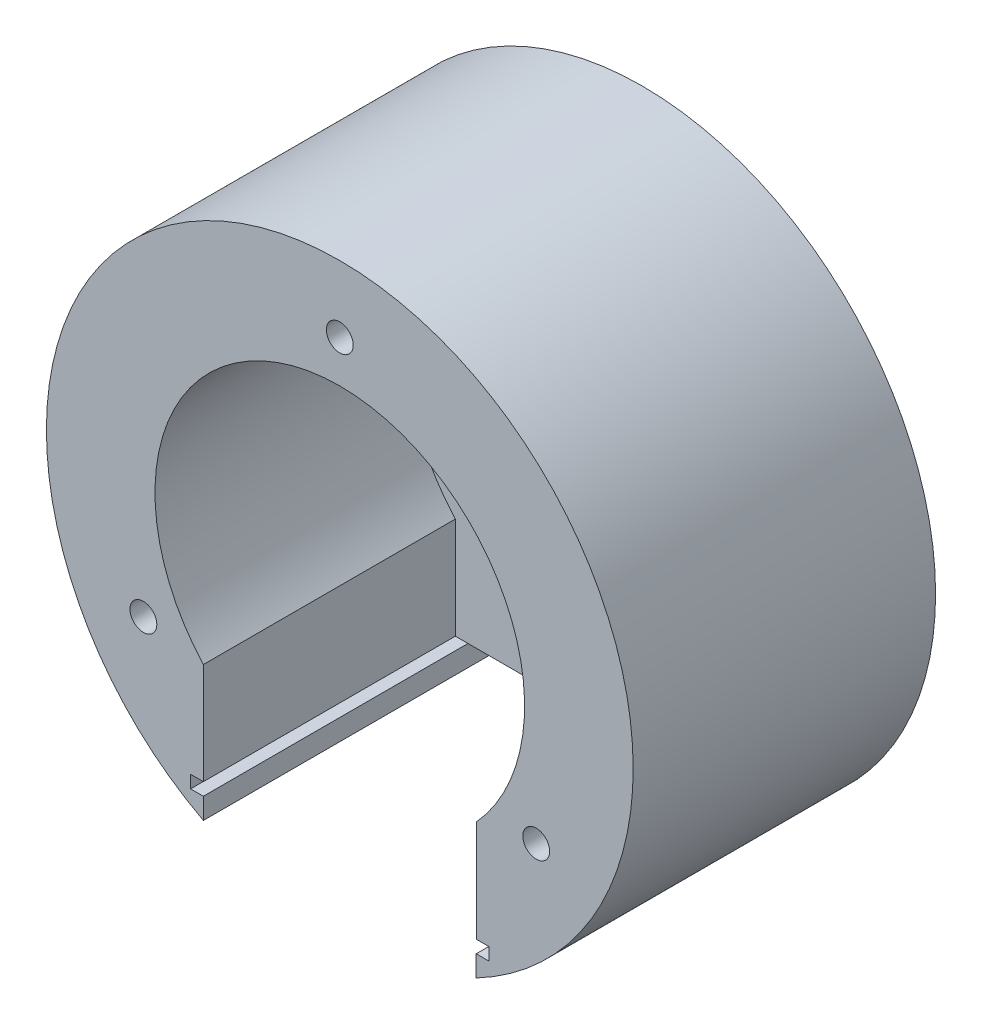
ISO-10303-21;
HEADER;
FILE_DESCRIPTION(('STEP AP214'),'2;1');
FILE_NAME('part.step','',(''),(''),'','','');
FILE_SCHEMA(('AUTOMOTIVE_DESIGN { 1 0 10303 214 1 1 1 1 }'));
ENDSEC;
DATA;
#1=APPLICATION_CONTEXT('core data for automotive mechanical design processes');
#2=APPLICATION_PROTOCOL_DEFINITION('international standard','automotive_design',2000,#1);
#3=PRODUCT_CONTEXT('',#1,'mechanical');
#4=PRODUCT('Part','Part','',(#3));
#5=PRODUCT_RELATED_PRODUCT_CATEGORY('part','',(#4));
#6=PRODUCT_DEFINITION_FORMATION('','',#4);
#7=PRODUCT_DEFINITION_CONTEXT('part definition',#1,'design');
#8=PRODUCT_DEFINITION('design','',#6,#7);
#9=PRODUCT_DEFINITION_SHAPE('','',#8);
#10=(LENGTH_UNIT() NAMED_UNIT(*) SI_UNIT(.MILLI.,.METRE.));
#11=(NAMED_UNIT(*) PLANE_ANGLE_UNIT() SI_UNIT($,.RADIAN.));
#12=(NAMED_UNIT(*) SI_UNIT($,.STERADIAN.) SOLID_ANGLE_UNIT());
#13=UNCERTAINTY_MEASURE_WITH_UNIT(LENGTH_MEASURE(1.E-05),#10,'distance_accuracy_value','');
#14=(GEOMETRIC_REPRESENTATION_CONTEXT(3) GLOBAL_UNCERTAINTY_ASSIGNED_CONTEXT((#13)) GLOBAL_UNIT_ASSIGNED_CONTEXT((#10,
#11,#12)) REPRESENTATION_CONTEXT('',''));
#15=CARTESIAN_POINT('',(0.,0.,0.));
#16=DIRECTION('',(0.,0.,1.));
#17=DIRECTION('',(1.,0.,0.));
#18=AXIS2_PLACEMENT_3D('',#15,#16,#17);
#19=CARTESIAN_POINT('',(-8.125,-15.46,0.));
#20=DIRECTION('',(0.,1.,0.));
#21=DIRECTION('',(0.,0.,1.));
#22=AXIS2_PLACEMENT_3D('',#19,#20,#21);
#23=PLANE('',#22);
#24=DIRECTION('',(1.,0.,0.));
#25=VECTOR('',#24,1.);
#26=CARTESIAN_POINT('',(-8.11956318098455,-15.46,0.999999999999997));
#27=LINE('',#26,#25);
#28=CARTESIAN_POINT('',(-8.11956318098455,-15.46,0.999999999999997));
#29=VERTEX_POINT('',#28);
#30=CARTESIAN_POINT('',(8.11956318098455,-15.46,0.999999999999997));
#31=VERTEX_POINT('',#30);
#32=EDGE_CURVE('E172',#29,#31,#27,.T.);
#33=ORIENTED_EDGE('',*,*,#32,.F.);
#34=DIRECTION('',(0.,0.,-1.));
#35=VECTOR('',#34,1.);
#36=CARTESIAN_POINT('',(-8.11956318098455,-15.46,18.));
#37=LINE('',#36,#35);
#38=CARTESIAN_POINT('',(-8.11956318098455,-15.46,0.));
#39=VERTEX_POINT('',#38);
#40=EDGE_CURVE('E63',#39,#29,#37,.F.);
#41=ORIENTED_EDGE('',*,*,#40,.F.);
#42=DIRECTION('',(-1.,0.,0.));
#43=VECTOR('',#42,1.);
#44=CARTESIAN_POINT('',(-8.125,-15.46,0.));
#45=LINE('',#44,#43);
#46=CARTESIAN_POINT('',(8.11956318098455,-15.46,0.));
#47=VERTEX_POINT('',#46);
#48=EDGE_CURVE('E230',#47,#39,#45,.T.);
#49=ORIENTED_EDGE('',*,*,#48,.F.);
#50=DIRECTION('',(0.,0.,-1.));
#51=VECTOR('',#50,1.);
#52=CARTESIAN_POINT('',(8.11956318098455,-15.46,18.));
#53=LINE('',#52,#51);
#54=EDGE_CURVE('E233',#31,#47,#53,.T.);
#55=ORIENTED_EDGE('',*,*,#54,.F.);
#56=EDGE_LOOP('',(#33,#41,#49,#55));
#57=FACE_BOUND('',#56,.T.);
#58=ADVANCED_FACE('F40',(#57),#23,.F.);
#59=CARTESIAN_POINT('',(0.,0.,18.));
#60=DIRECTION('',(0.,0.,-1.));
#61=DIRECTION('',(-1.,0.,0.));
#62=AXIS2_PLACEMENT_3D('',#59,#60,#61);
#63=CYLINDRICAL_SURFACE('',#62,17.4625);
#64=CARTESIAN_POINT('',(0.,0.,18.));
#65=DIRECTION('',(0.,0.,1.));
#66=DIRECTION('',(1.,0.,0.));
#67=AXIS2_PLACEMENT_3D('',#64,#65,#66);
#68=CIRCLE('',#67,17.4625);
#69=CARTESIAN_POINT('',(8.11956318098455,-15.46,18.));
#70=VERTEX_POINT('',#69);
#71=CARTESIAN_POINT('',(-8.11956318098455,-15.46,18.));
#72=VERTEX_POINT('',#71);
#73=EDGE_CURVE('E11',#70,#72,#68,.T.);
#74=ORIENTED_EDGE('',*,*,#73,.F.);
#75=EDGE_CURVE('E234',#70,#31,#53,.T.);
#76=ORIENTED_EDGE('',*,*,#75,.T.);
#77=ORIENTED_EDGE('',*,*,#54,.T.);
#78=CARTESIAN_POINT('',(0.,0.,0.));
#79=DIRECTION('',(0.,0.,1.));
#80=DIRECTION('',(1.,0.,0.));
#81=AXIS2_PLACEMENT_3D('',#78,#79,#80);
#82=CIRCLE('',#81,17.4625);
#83=EDGE_CURVE('E44',#47,#39,#82,.T.);
#84=ORIENTED_EDGE('',*,*,#83,.T.);
#85=ORIENTED_EDGE('',*,*,#40,.T.);
#86=DIRECTION('',(0.,0.,1.));
#87=VECTOR('',#86,1.);
#88=CARTESIAN_POINT('',(-8.11956318098455,-15.46,0.999999999999997));
#89=LINE('',#88,#87);
#90=EDGE_CURVE('E204',#29,#72,#89,.T.);
#91=ORIENTED_EDGE('',*,*,#90,.T.);
#92=EDGE_LOOP('',(#74,#76,#77,#84,#85,#91));
#93=FACE_BOUND('',#92,.T.);
#94=ADVANCED_FACE('F42',(#93),#63,.T.);
#95=CARTESIAN_POINT('',(0.,0.,18.));
#96=DIRECTION('',(0.,0.,1.));
#97=DIRECTION('',(1.,0.,0.));
#98=AXIS2_PLACEMENT_3D('',#95,#96,#97);
#99=PLANE('',#98);
#100=DIRECTION('',(-1.,0.,0.));
#101=VECTOR('',#100,1.);
#102=CARTESIAN_POINT('',(8.13043681901545,-13.46,18.));
#103=LINE('',#102,#101);
#104=CARTESIAN_POINT('',(8.89043681901545,-13.46,18.));
#105=VERTEX_POINT('',#104);
#106=CARTESIAN_POINT('',(8.13043681901545,-13.46,18.));
#107=VERTEX_POINT('',#106);
#108=EDGE_CURVE('E164',#105,#107,#103,.T.);
#109=ORIENTED_EDGE('',*,*,#108,.F.);
#110=DIRECTION('',(0.,1.,0.));
#111=VECTOR('',#110,1.);
#112=CARTESIAN_POINT('',(8.89043681901545,-13.46,18.));
#113=LINE('',#112,#111);
#114=CARTESIAN_POINT('',(8.89043681901545,-14.21,18.));
#115=VERTEX_POINT('',#114);
#116=EDGE_CURVE('E194',#115,#105,#113,.T.);
#117=ORIENTED_EDGE('',*,*,#116,.F.);
#118=DIRECTION('',(1.,0.,0.));
#119=VECTOR('',#118,1.);
#120=CARTESIAN_POINT('',(8.89043681901545,-14.21,18.));
#121=LINE('',#120,#119);
#122=CARTESIAN_POINT('',(8.11956318098455,-14.21,18.));
#123=VERTEX_POINT('',#122);
#124=EDGE_CURVE('E191',#123,#115,#121,.T.);
#125=ORIENTED_EDGE('',*,*,#124,.F.);
#126=DIRECTION('',(0.,1.,0.));
#127=VECTOR('',#126,1.);
#128=CARTESIAN_POINT('',(8.11956318098455,-15.46,18.));
#129=LINE('',#128,#127);
#130=EDGE_CURVE('E188',#70,#123,#129,.T.);
#131=ORIENTED_EDGE('',*,*,#130,.F.);
#132=ORIENTED_EDGE('',*,*,#73,.T.);
#133=DIRECTION('',(0.,-1.,0.));
#134=VECTOR('',#133,1.);
#135=CARTESIAN_POINT('',(-8.11956318098455,-14.21,18.));
#136=LINE('',#135,#134);
#137=CARTESIAN_POINT('',(-8.11956318098455,-14.21,18.));
#138=VERTEX_POINT('',#137);
#139=EDGE_CURVE('E186',#138,#72,#136,.T.);
#140=ORIENTED_EDGE('',*,*,#139,.F.);
#141=DIRECTION('',(1.,0.,0.));
#142=VECTOR('',#141,1.);
#143=CARTESIAN_POINT('',(-8.87956318098455,-14.21,18.));
#144=LINE('',#143,#142);
#145=CARTESIAN_POINT('',(-8.87956318098455,-14.21,18.));
#146=VERTEX_POINT('',#145);
#147=EDGE_CURVE('E183',#146,#138,#144,.T.);
#148=ORIENTED_EDGE('',*,*,#147,.F.);
#149=DIRECTION('',(0.,-1.,0.));
#150=VECTOR('',#149,1.);
#151=CARTESIAN_POINT('',(-8.87956318098455,-13.46,18.));
#152=LINE('',#151,#150);
#153=CARTESIAN_POINT('',(-8.87956318098455,-13.46,18.));
#154=VERTEX_POINT('',#153);
#155=EDGE_CURVE('E181',#154,#146,#152,.T.);
#156=ORIENTED_EDGE('',*,*,#155,.F.);
#157=CARTESIAN_POINT('',(-8.11956318098455,-13.46,18.));
#158=VERTEX_POINT('',#157);
#159=EDGE_CURVE('E145',#158,#154,#103,.T.);
#160=ORIENTED_EDGE('',*,*,#159,.F.);
#161=DIRECTION('',(0.,-1.,0.));
#162=VECTOR('',#161,1.);
#163=CARTESIAN_POINT('',(-8.11956318098455,-6.75863679021441,18.));
#164=LINE('',#163,#162);
#165=CARTESIAN_POINT('',(-8.11956318098455,-7.42109788036784,18.));
#166=VERTEX_POINT('',#165);
#167=EDGE_CURVE('E199',#166,#158,#164,.T.);
#168=ORIENTED_EDGE('',*,*,#167,.F.);
#169=CARTESIAN_POINT('',(0.,0.,18.));
#170=DIRECTION('',(0.,0.,1.));
#171=DIRECTION('',(1.,0.,0.));
#172=AXIS2_PLACEMENT_3D('',#169,#170,#171);
#173=CIRCLE('',#172,11.);
#174=CARTESIAN_POINT('',(8.13043681901545,-7.4091832972331,18.));
#175=VERTEX_POINT('',#174);
#176=EDGE_CURVE('E237',#175,#166,#173,.T.);
#177=ORIENTED_EDGE('',*,*,#176,.F.);
#178=DIRECTION('',(0.,1.,0.));
#179=VECTOR('',#178,1.);
#180=CARTESIAN_POINT('',(8.13043681901545,-6.75863679021441,18.));
#181=LINE('',#180,#179);
#182=EDGE_CURVE('E217',#107,#175,#181,.T.);
#183=ORIENTED_EDGE('',*,*,#182,.F.);
#184=EDGE_LOOP('',(#109,#117,#125,#131,#132,#140,#148,#156,#160,#168,#177,#183));
#185=FACE_BOUND('',#184,.T.);
#186=CARTESIAN_POINT('',(6.12383107306205E-13,13.5,18.));
#187=DIRECTION('',(0.,0.,1.));
#188=DIRECTION('',(1.,0.,0.));
#189=AXIS2_PLACEMENT_3D('',#186,#187,#188);
#190=CIRCLE('',#189,0.8);
#191=CARTESIAN_POINT('',(0.800000000000613,13.5,18.));
#192=VERTEX_POINT('',#191);
#193=EDGE_CURVE('E246',#192,#192,#190,.T.);
#194=ORIENTED_EDGE('',*,*,#193,.F.);
#195=EDGE_LOOP('',(#194));
#196=FACE_BOUND('',#195,.T.);
#197=CARTESIAN_POINT('',(11.6913429510902,-6.7500000000002,18.));
#198=DIRECTION('',(0.,0.,1.));
#199=DIRECTION('',(1.,0.,0.));
#200=AXIS2_PLACEMENT_3D('',#197,#198,#199);
#201=CIRCLE('',#200,0.800000000000001);
#202=CARTESIAN_POINT('',(12.4913429510902,-6.7500000000002,18.));
#203=VERTEX_POINT('',#202);
#204=EDGE_CURVE('E249',#203,#203,#201,.T.);
#205=ORIENTED_EDGE('',*,*,#204,.F.);
#206=EDGE_LOOP('',(#205));
#207=FACE_BOUND('',#206,.T.);
#208=CARTESIAN_POINT('',(-11.6913429510897,-6.74999999999979,18.));
#209=DIRECTION('',(0.,0.,1.));
#210=DIRECTION('',(1.,0.,0.));
#211=AXIS2_PLACEMENT_3D('',#208,#209,#210);
#212=CIRCLE('',#211,0.800000000000001);
#213=CARTESIAN_POINT('',(-10.8913429510897,-6.74999999999979,18.));
#214=VERTEX_POINT('',#213);
#215=EDGE_CURVE('E255',#214,#214,#212,.T.);
#216=ORIENTED_EDGE('',*,*,#215,.F.);
#217=EDGE_LOOP('',(#216));
#218=FACE_BOUND('',#217,.T.);
#219=ADVANCED_FACE('F270',(#185,#196,#207,#218),#99,.T.);
#220=CARTESIAN_POINT('',(0.,0.,0.));
#221=DIRECTION('',(0.,0.,1.));
#222=DIRECTION('',(1.,0.,0.));
#223=AXIS2_PLACEMENT_3D('',#220,#221,#222);
#224=PLANE('',#223);
#225=ORIENTED_EDGE('',*,*,#83,.F.);
#226=ORIENTED_EDGE('',*,*,#48,.T.);
#227=EDGE_LOOP('',(#225,#226));
#228=FACE_BOUND('',#227,.T.);
#229=ADVANCED_FACE('F266',(#228),#224,.F.);
#230=CARTESIAN_POINT('',(-11.6913429510897,-6.74999999999979,8.));
#231=DIRECTION('',(0.,0.,1.));
#232=DIRECTION('',(1.,0.,0.));
#233=AXIS2_PLACEMENT_3D('',#230,#231,#232);
#234=CYLINDRICAL_SURFACE('',#233,0.800000000000001);
#235=CARTESIAN_POINT('',(-11.6913429510897,-6.74999999999979,8.));
#236=DIRECTION('',(0.,0.,1.));
#237=DIRECTION('',(1.,0.,0.));
#238=AXIS2_PLACEMENT_3D('',#235,#236,#237);
#239=CIRCLE('',#238,0.800000000000001);
#240=CARTESIAN_POINT('',(-10.8913429510897,-6.74999999999979,8.));
#241=VERTEX_POINT('',#240);
#242=EDGE_CURVE('E240',#241,#241,#239,.T.);
#243=ORIENTED_EDGE('',*,*,#242,.F.);
#244=EDGE_LOOP('',(#243));
#245=FACE_BOUND('',#244,.T.);
#246=ORIENTED_EDGE('',*,*,#215,.T.);
#247=EDGE_LOOP('',(#246));
#248=FACE_BOUND('',#247,.T.);
#249=ADVANCED_FACE('F263',(#245,#248),#234,.F.);
#250=CARTESIAN_POINT('',(-11.6913429510897,-6.74999999999979,8.));
#251=DIRECTION('',(0.,0.,1.));
#252=DIRECTION('',(1.,0.,0.));
#253=AXIS2_PLACEMENT_3D('',#250,#251,#252);
#254=PLANE('',#253);
#255=ORIENTED_EDGE('',*,*,#242,.T.);
#256=EDGE_LOOP('',(#255));
#257=FACE_BOUND('',#256,.T.);
#258=ADVANCED_FACE('F261',(#257),#254,.T.);
#259=CARTESIAN_POINT('',(11.6913429510902,-6.7500000000002,8.));
#260=DIRECTION('',(0.,0.,1.));
#261=DIRECTION('',(1.,0.,0.));
#262=AXIS2_PLACEMENT_3D('',#259,#260,#261);
#263=CYLINDRICAL_SURFACE('',#262,0.800000000000001);
#264=CARTESIAN_POINT('',(11.6913429510902,-6.7500000000002,8.));
#265=DIRECTION('',(0.,0.,1.));
#266=DIRECTION('',(1.,0.,0.));
#267=AXIS2_PLACEMENT_3D('',#264,#265,#266);
#268=CIRCLE('',#267,0.800000000000001);
#269=CARTESIAN_POINT('',(12.4913429510902,-6.7500000000002,8.));
#270=VERTEX_POINT('',#269);
#271=EDGE_CURVE('E252',#270,#270,#268,.T.);
#272=ORIENTED_EDGE('',*,*,#271,.F.);
#273=EDGE_LOOP('',(#272));
#274=FACE_BOUND('',#273,.T.);
#275=ORIENTED_EDGE('',*,*,#204,.T.);
#276=EDGE_LOOP('',(#275));
#277=FACE_BOUND('',#276,.T.);
#278=ADVANCED_FACE('F308',(#274,#277),#263,.F.);
#279=CARTESIAN_POINT('',(11.6913429510902,-6.7500000000002,8.));
#280=DIRECTION('',(0.,0.,1.));
#281=DIRECTION('',(1.,0.,0.));
#282=AXIS2_PLACEMENT_3D('',#279,#280,#281);
#283=PLANE('',#282);
#284=ORIENTED_EDGE('',*,*,#271,.T.);
#285=EDGE_LOOP('',(#284));
#286=FACE_BOUND('',#285,.T.);
#287=ADVANCED_FACE('F306',(#286),#283,.T.);
#288=CARTESIAN_POINT('',(6.12383107306205E-13,13.5,8.));
#289=DIRECTION('',(0.,0.,1.));
#290=DIRECTION('',(1.,0.,0.));
#291=AXIS2_PLACEMENT_3D('',#288,#289,#290);
#292=CYLINDRICAL_SURFACE('',#291,0.8);
#293=CARTESIAN_POINT('',(6.12383107306205E-13,13.5,8.));
#294=DIRECTION('',(0.,0.,1.));
#295=DIRECTION('',(1.,0.,0.));
#296=AXIS2_PLACEMENT_3D('',#293,#294,#295);
#297=CIRCLE('',#296,0.8);
#298=CARTESIAN_POINT('',(0.800000000000613,13.5,8.));
#299=VERTEX_POINT('',#298);
#300=EDGE_CURVE('E243',#299,#299,#297,.T.);
#301=ORIENTED_EDGE('',*,*,#300,.F.);
#302=EDGE_LOOP('',(#301));
#303=FACE_BOUND('',#302,.T.);
#304=ORIENTED_EDGE('',*,*,#193,.T.);
#305=EDGE_LOOP('',(#304));
#306=FACE_BOUND('',#305,.T.);
#307=ADVANCED_FACE('F302',(#303,#306),#292,.F.);
#308=CARTESIAN_POINT('',(6.12383107306205E-13,13.5,8.));
#309=DIRECTION('',(0.,0.,1.));
#310=DIRECTION('',(1.,0.,0.));
#311=AXIS2_PLACEMENT_3D('',#308,#309,#310);
#312=PLANE('',#311);
#313=ORIENTED_EDGE('',*,*,#300,.T.);
#314=EDGE_LOOP('',(#313));
#315=FACE_BOUND('',#314,.T.);
#316=ADVANCED_FACE('F298',(#315),#312,.T.);
#317=CARTESIAN_POINT('',(0.,0.,3.));
#318=DIRECTION('',(0.,0.,1.));
#319=DIRECTION('',(1.,0.,0.));
#320=AXIS2_PLACEMENT_3D('',#317,#318,#319);
#321=CYLINDRICAL_SURFACE('',#320,11.);
#322=ORIENTED_EDGE('',*,*,#176,.T.);
#323=DIRECTION('',(0.,0.,1.));
#324=VECTOR('',#323,1.);
#325=CARTESIAN_POINT('',(-8.11956318098455,-7.42109788036784,3.));
#326=LINE('',#325,#324);
#327=CARTESIAN_POINT('',(-8.11956318098455,-7.42109788036784,3.));
#328=VERTEX_POINT('',#327);
#329=EDGE_CURVE('E227',#166,#328,#326,.F.);
#330=ORIENTED_EDGE('',*,*,#329,.T.);
#331=CARTESIAN_POINT('',(0.,0.,3.));
#332=DIRECTION('',(0.,0.,1.));
#333=DIRECTION('',(1.,0.,0.));
#334=AXIS2_PLACEMENT_3D('',#331,#332,#333);
#335=CIRCLE('',#334,11.);
#336=CARTESIAN_POINT('',(8.13043681901545,-7.4091832972331,3.));
#337=VERTEX_POINT('',#336);
#338=EDGE_CURVE('E238',#337,#328,#335,.T.);
#339=ORIENTED_EDGE('',*,*,#338,.F.);
#340=DIRECTION('',(0.,0.,1.));
#341=VECTOR('',#340,1.);
#342=CARTESIAN_POINT('',(8.13043681901545,-7.4091832972331,3.));
#343=LINE('',#342,#341);
#344=EDGE_CURVE('E224',#337,#175,#343,.T.);
#345=ORIENTED_EDGE('',*,*,#344,.T.);
#346=EDGE_LOOP('',(#322,#330,#339,#345));
#347=FACE_BOUND('',#346,.T.);
#348=ADVANCED_FACE('F295',(#347),#321,.F.);
#349=CARTESIAN_POINT('',(0.,0.,3.));
#350=DIRECTION('',(0.,0.,1.));
#351=DIRECTION('',(1.,0.,0.));
#352=AXIS2_PLACEMENT_3D('',#349,#350,#351);
#353=PLANE('',#352);
#354=ORIENTED_EDGE('',*,*,#338,.T.);
#355=DIRECTION('',(0.,1.,0.));
#356=VECTOR('',#355,1.);
#357=CARTESIAN_POINT('',(-8.11956318098455,-6.75863679021441,3.));
#358=LINE('',#357,#356);
#359=CARTESIAN_POINT('',(-8.11956318098455,-13.46,3.));
#360=VERTEX_POINT('',#359);
#361=EDGE_CURVE('E211',#360,#328,#358,.T.);
#362=ORIENTED_EDGE('',*,*,#361,.F.);
#363=DIRECTION('',(-1.,0.,0.));
#364=VECTOR('',#363,1.);
#365=CARTESIAN_POINT('',(-8.11956318098455,-13.46,3.));
#366=LINE('',#365,#364);
#367=CARTESIAN_POINT('',(8.13043681901545,-13.46,3.));
#368=VERTEX_POINT('',#367);
#369=EDGE_CURVE('E214',#368,#360,#366,.T.);
#370=ORIENTED_EDGE('',*,*,#369,.F.);
#371=DIRECTION('',(0.,-1.,0.));
#372=VECTOR('',#371,1.);
#373=CARTESIAN_POINT('',(8.13043681901545,-6.75863679021441,3.));
#374=LINE('',#373,#372);
#375=EDGE_CURVE('E55',#337,#368,#374,.T.);
#376=ORIENTED_EDGE('',*,*,#375,.F.);
#377=EDGE_LOOP('',(#354,#362,#370,#376));
#378=FACE_BOUND('',#377,.T.);
#379=ADVANCED_FACE('F293',(#378),#353,.T.);
#380=CARTESIAN_POINT('',(-8.11956318098455,-6.75863679021441,-14.5775643611243));
#381=DIRECTION('',(-1.,0.,0.));
#382=DIRECTION('',(0.,-1.,0.));
#383=AXIS2_PLACEMENT_3D('',#380,#381,#382);
#384=PLANE('',#383);
#385=ORIENTED_EDGE('',*,*,#167,.T.);
#386=DIRECTION('',(0.,0.,1.));
#387=VECTOR('',#386,1.);
#388=CARTESIAN_POINT('',(-8.11956318098455,-13.46,-14.5775643611243));
#389=LINE('',#388,#387);
#390=EDGE_CURVE('E219',#360,#158,#389,.T.);
#391=ORIENTED_EDGE('',*,*,#390,.F.);
#392=ORIENTED_EDGE('',*,*,#361,.T.);
#393=ORIENTED_EDGE('',*,*,#329,.F.);
#394=EDGE_LOOP('',(#385,#391,#392,#393));
#395=FACE_BOUND('',#394,.T.);
#396=ADVANCED_FACE('F291',(#395),#384,.F.);
#397=CARTESIAN_POINT('',(8.13043681901545,-6.75863679021441,-14.5775643611243));
#398=DIRECTION('',(1.,0.,0.));
#399=DIRECTION('',(0.,1.,0.));
#400=AXIS2_PLACEMENT_3D('',#397,#398,#399);
#401=PLANE('',#400);
#402=ORIENTED_EDGE('',*,*,#375,.T.);
#403=DIRECTION('',(0.,0.,1.));
#404=VECTOR('',#403,1.);
#405=CARTESIAN_POINT('',(8.13043681901545,-13.46,-14.5775643611243));
#406=LINE('',#405,#404);
#407=EDGE_CURVE('E212',#368,#107,#406,.T.);
#408=ORIENTED_EDGE('',*,*,#407,.T.);
#409=ORIENTED_EDGE('',*,*,#182,.T.);
#410=ORIENTED_EDGE('',*,*,#344,.F.);
#411=EDGE_LOOP('',(#402,#408,#409,#410));
#412=FACE_BOUND('',#411,.T.);
#413=ADVANCED_FACE('F353',(#412),#401,.F.);
#414=CARTESIAN_POINT('',(8.13043681901545,-13.46,0.999999999999997));
#415=DIRECTION('',(0.,1.,0.));
#416=DIRECTION('',(-1.,0.,0.));
#417=AXIS2_PLACEMENT_3D('',#414,#415,#416);
#418=PLANE('',#417);
#419=ORIENTED_EDGE('',*,*,#159,.T.);
#420=DIRECTION('',(0.,0.,1.));
#421=VECTOR('',#420,1.);
#422=CARTESIAN_POINT('',(-8.87956318098455,-13.46,0.999999999999997));
#423=LINE('',#422,#421);
#424=CARTESIAN_POINT('',(-8.87956318098455,-13.46,0.999999999999997));
#425=VERTEX_POINT('',#424);
#426=EDGE_CURVE('E138',#425,#154,#423,.T.);
#427=ORIENTED_EDGE('',*,*,#426,.F.);
#428=DIRECTION('',(-1.,0.,0.));
#429=VECTOR('',#428,1.);
#430=CARTESIAN_POINT('',(-8.11956318098455,-13.46,0.999999999999997));
#431=LINE('',#430,#429);
#432=CARTESIAN_POINT('',(8.89043681901545,-13.46,0.999999999999997));
#433=VERTEX_POINT('',#432);
#434=EDGE_CURVE('E142',#433,#425,#431,.T.);
#435=ORIENTED_EDGE('',*,*,#434,.F.);
#436=DIRECTION('',(0.,0.,1.));
#437=VECTOR('',#436,1.);
#438=CARTESIAN_POINT('',(8.89043681901545,-13.46,0.999999999999997));
#439=LINE('',#438,#437);
#440=EDGE_CURVE('E197',#433,#105,#439,.T.);
#441=ORIENTED_EDGE('',*,*,#440,.T.);
#442=ORIENTED_EDGE('',*,*,#108,.T.);
#443=ORIENTED_EDGE('',*,*,#407,.F.);
#444=ORIENTED_EDGE('',*,*,#369,.T.);
#445=ORIENTED_EDGE('',*,*,#390,.T.);
#446=EDGE_LOOP('',(#419,#427,#435,#441,#442,#443,#444,#445));
#447=FACE_BOUND('',#446,.T.);
#448=ADVANCED_FACE('F140',(#447),#418,.F.);
#449=CARTESIAN_POINT('',(8.89043681901545,-13.46,0.999999999999997));
#450=DIRECTION('',(1.,0.,0.));
#451=DIRECTION('',(0.,0.,-1.));
#452=AXIS2_PLACEMENT_3D('',#449,#450,#451);
#453=PLANE('',#452);
#454=ORIENTED_EDGE('',*,*,#116,.T.);
#455=ORIENTED_EDGE('',*,*,#440,.F.);
#456=DIRECTION('',(0.,1.,0.));
#457=VECTOR('',#456,1.);
#458=CARTESIAN_POINT('',(8.89043681901545,-13.46,0.999999999999997));
#459=LINE('',#458,#457);
#460=CARTESIAN_POINT('',(8.89043681901545,-14.21,0.999999999999997));
#461=VERTEX_POINT('',#460);
#462=EDGE_CURVE('E150',#461,#433,#459,.T.);
#463=ORIENTED_EDGE('',*,*,#462,.F.);
#464=DIRECTION('',(0.,0.,1.));
#465=VECTOR('',#464,1.);
#466=CARTESIAN_POINT('',(8.89043681901545,-14.21,0.999999999999997));
#467=LINE('',#466,#465);
#468=EDGE_CURVE('E200',#461,#115,#467,.T.);
#469=ORIENTED_EDGE('',*,*,#468,.T.);
#470=EDGE_LOOP('',(#454,#455,#463,#469));
#471=FACE_BOUND('',#470,.T.);
#472=ADVANCED_FACE('F377',(#471),#453,.F.);
#473=CARTESIAN_POINT('',(8.89043681901545,-14.21,0.999999999999997));
#474=DIRECTION('',(0.,-1.,0.));
#475=DIRECTION('',(0.,0.,-1.));
#476=AXIS2_PLACEMENT_3D('',#473,#474,#475);
#477=PLANE('',#476);
#478=ORIENTED_EDGE('',*,*,#124,.T.);
#479=ORIENTED_EDGE('',*,*,#468,.F.);
#480=DIRECTION('',(1.,0.,0.));
#481=VECTOR('',#480,1.);
#482=CARTESIAN_POINT('',(8.89043681901545,-14.21,0.999999999999997));
#483=LINE('',#482,#481);
#484=CARTESIAN_POINT('',(8.11956318098455,-14.21,0.999999999999997));
#485=VERTEX_POINT('',#484);
#486=EDGE_CURVE('E178',#485,#461,#483,.T.);
#487=ORIENTED_EDGE('',*,*,#486,.F.);
#488=DIRECTION('',(0.,0.,1.));
#489=VECTOR('',#488,1.);
#490=CARTESIAN_POINT('',(8.11956318098455,-14.21,0.999999999999997));
#491=LINE('',#490,#489);
#492=EDGE_CURVE('E202',#485,#123,#491,.T.);
#493=ORIENTED_EDGE('',*,*,#492,.T.);
#494=EDGE_LOOP('',(#478,#479,#487,#493));
#495=FACE_BOUND('',#494,.T.);
#496=ADVANCED_FACE('F384',(#495),#477,.F.);
#497=CARTESIAN_POINT('',(8.11956318098455,-15.46,0.999999999999997));
#498=DIRECTION('',(1.,0.,0.));
#499=DIRECTION('',(0.,0.,-1.));
#500=AXIS2_PLACEMENT_3D('',#497,#498,#499);
#501=PLANE('',#500);
#502=ORIENTED_EDGE('',*,*,#130,.T.);
#503=ORIENTED_EDGE('',*,*,#492,.F.);
#504=DIRECTION('',(0.,1.,0.));
#505=VECTOR('',#504,1.);
#506=CARTESIAN_POINT('',(8.11956318098455,-15.46,0.999999999999997));
#507=LINE('',#506,#505);
#508=EDGE_CURVE('E175',#31,#485,#507,.T.);
#509=ORIENTED_EDGE('',*,*,#508,.F.);
#510=ORIENTED_EDGE('',*,*,#75,.F.);
#511=EDGE_LOOP('',(#502,#503,#509,#510));
#512=FACE_BOUND('',#511,.T.);
#513=ADVANCED_FACE('F392',(#512),#501,.F.);
#514=CARTESIAN_POINT('',(-8.11956318098455,-14.21,0.999999999999997));
#515=DIRECTION('',(-1.,0.,0.));
#516=DIRECTION('',(0.,0.,1.));
#517=AXIS2_PLACEMENT_3D('',#514,#515,#516);
#518=PLANE('',#517);
#519=ORIENTED_EDGE('',*,*,#139,.T.);
#520=ORIENTED_EDGE('',*,*,#90,.F.);
#521=DIRECTION('',(0.,-1.,0.));
#522=VECTOR('',#521,1.);
#523=CARTESIAN_POINT('',(-8.11956318098455,-14.21,0.999999999999997));
#524=LINE('',#523,#522);
#525=CARTESIAN_POINT('',(-8.11956318098455,-14.21,0.999999999999997));
#526=VERTEX_POINT('',#525);
#527=EDGE_CURVE('E169',#526,#29,#524,.T.);
#528=ORIENTED_EDGE('',*,*,#527,.F.);
#529=DIRECTION('',(0.,0.,1.));
#530=VECTOR('',#529,1.);
#531=CARTESIAN_POINT('',(-8.11956318098455,-14.21,0.999999999999997));
#532=LINE('',#531,#530);
#533=EDGE_CURVE('E207',#526,#138,#532,.T.);
#534=ORIENTED_EDGE('',*,*,#533,.T.);
#535=EDGE_LOOP('',(#519,#520,#528,#534));
#536=FACE_BOUND('',#535,.T.);
#537=ADVANCED_FACE('F400',(#536),#518,.F.);
#538=CARTESIAN_POINT('',(-8.87956318098455,-14.21,0.999999999999997));
#539=DIRECTION('',(0.,-1.,0.));
#540=DIRECTION('',(0.,0.,-1.));
#541=AXIS2_PLACEMENT_3D('',#538,#539,#540);
#542=PLANE('',#541);
#543=ORIENTED_EDGE('',*,*,#147,.T.);
#544=ORIENTED_EDGE('',*,*,#533,.F.);
#545=DIRECTION('',(1.,0.,0.));
#546=VECTOR('',#545,1.);
#547=CARTESIAN_POINT('',(-8.87956318098455,-14.21,0.999999999999997));
#548=LINE('',#547,#546);
#549=CARTESIAN_POINT('',(-8.87956318098455,-14.21,0.999999999999997));
#550=VERTEX_POINT('',#549);
#551=EDGE_CURVE('E158',#550,#526,#548,.T.);
#552=ORIENTED_EDGE('',*,*,#551,.F.);
#553=DIRECTION('',(0.,0.,1.));
#554=VECTOR('',#553,1.);
#555=CARTESIAN_POINT('',(-8.87956318098455,-14.21,0.999999999999997));
#556=LINE('',#555,#554);
#557=EDGE_CURVE('E149',#550,#146,#556,.T.);
#558=ORIENTED_EDGE('',*,*,#557,.T.);
#559=EDGE_LOOP('',(#543,#544,#552,#558));
#560=FACE_BOUND('',#559,.T.);
#561=ADVANCED_FACE('F408',(#560),#542,.F.);
#562=CARTESIAN_POINT('',(-8.87956318098455,-13.46,0.999999999999997));
#563=DIRECTION('',(-1.,0.,0.));
#564=DIRECTION('',(0.,0.,1.));
#565=AXIS2_PLACEMENT_3D('',#562,#563,#564);
#566=PLANE('',#565);
#567=ORIENTED_EDGE('',*,*,#155,.T.);
#568=ORIENTED_EDGE('',*,*,#557,.F.);
#569=DIRECTION('',(0.,-1.,0.));
#570=VECTOR('',#569,1.);
#571=CARTESIAN_POINT('',(-8.87956318098455,-13.46,0.999999999999997));
#572=LINE('',#571,#570);
#573=EDGE_CURVE('E153',#425,#550,#572,.T.);
#574=ORIENTED_EDGE('',*,*,#573,.F.);
#575=ORIENTED_EDGE('',*,*,#426,.T.);
#576=EDGE_LOOP('',(#567,#568,#574,#575));
#577=FACE_BOUND('',#576,.T.);
#578=ADVANCED_FACE('F154',(#577),#566,.F.);
#579=CARTESIAN_POINT('',(0.,0.,0.999999999999997));
#580=DIRECTION('',(0.,0.,1.));
#581=DIRECTION('',(1.,0.,0.));
#582=AXIS2_PLACEMENT_3D('',#579,#580,#581);
#583=PLANE('',#582);
#584=ORIENTED_EDGE('',*,*,#434,.T.);
#585=ORIENTED_EDGE('',*,*,#573,.T.);
#586=ORIENTED_EDGE('',*,*,#551,.T.);
#587=ORIENTED_EDGE('',*,*,#527,.T.);
#588=ORIENTED_EDGE('',*,*,#32,.T.);
#589=ORIENTED_EDGE('',*,*,#508,.T.);
#590=ORIENTED_EDGE('',*,*,#486,.T.);
#591=ORIENTED_EDGE('',*,*,#462,.T.);
#592=EDGE_LOOP('',(#584,#585,#586,#587,#588,#589,#590,#591));
#593=FACE_BOUND('',#592,.T.);
#594=ADVANCED_FACE('F161',(#593),#583,.T.);
#595=CLOSED_SHELL('',(#58,#94,#219,#229,#249,#258,#278,#287,#307,#316,#348,#379,#396,#413,#448,
#472,#496,#513,#537,#561,#578,#594));
#596=MANIFOLD_SOLID_BREP('B2',#595);
#597=ADVANCED_BREP_SHAPE_REPRESENTATION('',(#18,#596),#14);
#598=SHAPE_DEFINITION_REPRESENTATION(#9,#597);
ENDSEC;
END-ISO-10303-21;
